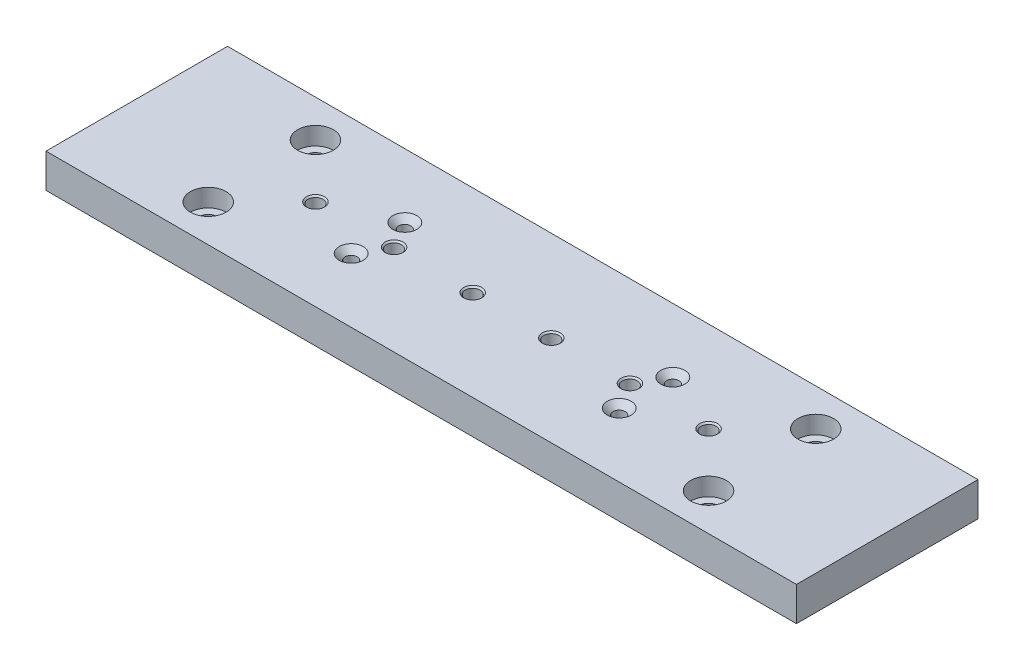
ISO-10303-21;
HEADER;
FILE_DESCRIPTION(('STEP AP214'),'2;1');
FILE_NAME('part.step','',(''),(''),'','','');
FILE_SCHEMA(('AUTOMOTIVE_DESIGN { 1 0 10303 214 1 1 1 1 }'));
ENDSEC;
DATA;
#1=APPLICATION_CONTEXT('core data for automotive mechanical design processes');
#2=APPLICATION_PROTOCOL_DEFINITION('international standard','automotive_design',2000,#1);
#3=PRODUCT_CONTEXT('',#1,'mechanical');
#4=PRODUCT('Part','Part','',(#3));
#5=PRODUCT_RELATED_PRODUCT_CATEGORY('part','',(#4));
#6=PRODUCT_DEFINITION_FORMATION('','',#4);
#7=PRODUCT_DEFINITION_CONTEXT('part definition',#1,'design');
#8=PRODUCT_DEFINITION('design','',#6,#7);
#9=PRODUCT_DEFINITION_SHAPE('','',#8);
#10=(LENGTH_UNIT() NAMED_UNIT(*) SI_UNIT(.MILLI.,.METRE.));
#11=(NAMED_UNIT(*) PLANE_ANGLE_UNIT() SI_UNIT($,.RADIAN.));
#12=(NAMED_UNIT(*) SI_UNIT($,.STERADIAN.) SOLID_ANGLE_UNIT());
#13=UNCERTAINTY_MEASURE_WITH_UNIT(LENGTH_MEASURE(1.E-05),#10,'distance_accuracy_value','');
#14=(GEOMETRIC_REPRESENTATION_CONTEXT(3) GLOBAL_UNCERTAINTY_ASSIGNED_CONTEXT((#13)) GLOBAL_UNIT_ASSIGNED_CONTEXT((#10,
#11,#12)) REPRESENTATION_CONTEXT('',''));
#15=CARTESIAN_POINT('',(0.,0.,0.));
#16=DIRECTION('',(0.,0.,1.));
#17=DIRECTION('',(1.,0.,0.));
#18=AXIS2_PLACEMENT_3D('',#15,#16,#17);
#19=CARTESIAN_POINT('',(0.,0.,0.));
#20=DIRECTION('',(0.,-1.,0.));
#21=DIRECTION('',(0.,0.,-1.));
#22=AXIS2_PLACEMENT_3D('',#19,#20,#21);
#23=PLANE('',#22);
#24=CARTESIAN_POINT('',(-55.,0.,0.));
#25=DIRECTION('',(0.,1.,0.));
#26=DIRECTION('',(0.,0.,1.));
#27=AXIS2_PLACEMENT_3D('',#24,#25,#26);
#28=CIRCLE('',#27,2.1);
#29=CARTESIAN_POINT('',(-55.,0.,2.1));
#30=VERTEX_POINT('',#29);
#31=EDGE_CURVE('E261',#30,#30,#28,.T.);
#32=ORIENTED_EDGE('',*,*,#31,.T.);
#33=EDGE_LOOP('',(#32));
#34=FACE_BOUND('',#33,.T.);
#35=CARTESIAN_POINT('',(-33.,0.,0.));
#36=DIRECTION('',(0.,1.,0.));
#37=DIRECTION('',(0.,0.,1.));
#38=AXIS2_PLACEMENT_3D('',#35,#36,#37);
#39=CIRCLE('',#38,2.1);
#40=CARTESIAN_POINT('',(-33.,0.,2.1));
#41=VERTEX_POINT('',#40);
#42=EDGE_CURVE('E251',#41,#41,#39,.T.);
#43=ORIENTED_EDGE('',*,*,#42,.T.);
#44=EDGE_LOOP('',(#43));
#45=FACE_BOUND('',#44,.T.);
#46=CARTESIAN_POINT('',(-11.,0.,0.));
#47=DIRECTION('',(0.,1.,0.));
#48=DIRECTION('',(0.,0.,1.));
#49=AXIS2_PLACEMENT_3D('',#46,#47,#48);
#50=CIRCLE('',#49,2.1);
#51=CARTESIAN_POINT('',(-11.,0.,2.1));
#52=VERTEX_POINT('',#51);
#53=EDGE_CURVE('E241',#52,#52,#50,.T.);
#54=ORIENTED_EDGE('',*,*,#53,.T.);
#55=EDGE_LOOP('',(#54));
#56=FACE_BOUND('',#55,.T.);
#57=CARTESIAN_POINT('',(11.,0.,0.));
#58=DIRECTION('',(0.,1.,0.));
#59=DIRECTION('',(0.,0.,1.));
#60=AXIS2_PLACEMENT_3D('',#57,#58,#59);
#61=CIRCLE('',#60,2.1);
#62=CARTESIAN_POINT('',(11.,0.,2.1));
#63=VERTEX_POINT('',#62);
#64=EDGE_CURVE('E231',#63,#63,#61,.T.);
#65=ORIENTED_EDGE('',*,*,#64,.T.);
#66=EDGE_LOOP('',(#65));
#67=FACE_BOUND('',#66,.T.);
#68=CARTESIAN_POINT('',(33.,0.,0.));
#69=DIRECTION('',(0.,1.,0.));
#70=DIRECTION('',(0.,0.,1.));
#71=AXIS2_PLACEMENT_3D('',#68,#69,#70);
#72=CIRCLE('',#71,2.1);
#73=CARTESIAN_POINT('',(33.,0.,2.1));
#74=VERTEX_POINT('',#73);
#75=EDGE_CURVE('E221',#74,#74,#72,.T.);
#76=ORIENTED_EDGE('',*,*,#75,.T.);
#77=EDGE_LOOP('',(#76));
#78=FACE_BOUND('',#77,.T.);
#79=CARTESIAN_POINT('',(55.,0.,0.));
#80=DIRECTION('',(0.,1.,0.));
#81=DIRECTION('',(0.,0.,1.));
#82=AXIS2_PLACEMENT_3D('',#79,#80,#81);
#83=CIRCLE('',#82,2.1);
#84=CARTESIAN_POINT('',(55.,0.,2.1));
#85=VERTEX_POINT('',#84);
#86=EDGE_CURVE('E211',#85,#85,#83,.T.);
#87=ORIENTED_EDGE('',*,*,#86,.T.);
#88=EDGE_LOOP('',(#87));
#89=FACE_BOUND('',#88,.T.);
#90=CARTESIAN_POINT('',(70.,0.,15.));
#91=DIRECTION('',(0.,1.,0.));
#92=DIRECTION('',(0.,0.,1.));
#93=AXIS2_PLACEMENT_3D('',#90,#91,#92);
#94=CIRCLE('',#93,2.75);
#95=CARTESIAN_POINT('',(70.,0.,17.75));
#96=VERTEX_POINT('',#95);
#97=EDGE_CURVE('E185',#96,#96,#94,.T.);
#98=ORIENTED_EDGE('',*,*,#97,.T.);
#99=EDGE_LOOP('',(#98));
#100=FACE_BOUND('',#99,.T.);
#101=CARTESIAN_POINT('',(-70.,0.,-15.));
#102=DIRECTION('',(0.,1.,0.));
#103=DIRECTION('',(0.,0.,1.));
#104=AXIS2_PLACEMENT_3D('',#101,#102,#103);
#105=CIRCLE('',#104,2.75);
#106=CARTESIAN_POINT('',(-70.,0.,-12.25));
#107=VERTEX_POINT('',#106);
#108=EDGE_CURVE('E172',#107,#107,#105,.T.);
#109=ORIENTED_EDGE('',*,*,#108,.T.);
#110=EDGE_LOOP('',(#109));
#111=FACE_BOUND('',#110,.T.);
#112=CARTESIAN_POINT('',(-70.,0.,15.));
#113=DIRECTION('',(0.,1.,0.));
#114=DIRECTION('',(0.,0.,1.));
#115=AXIS2_PLACEMENT_3D('',#112,#113,#114);
#116=CIRCLE('',#115,2.75);
#117=CARTESIAN_POINT('',(-70.,0.,17.75));
#118=VERTEX_POINT('',#117);
#119=EDGE_CURVE('E159',#118,#118,#116,.T.);
#120=ORIENTED_EDGE('',*,*,#119,.T.);
#121=EDGE_LOOP('',(#120));
#122=FACE_BOUND('',#121,.T.);
#123=CARTESIAN_POINT('',(-37.5,0.,-7.5));
#124=DIRECTION('',(0.,1.,0.));
#125=DIRECTION('',(0.,0.,1.));
#126=AXIS2_PLACEMENT_3D('',#123,#124,#125);
#127=CIRCLE('',#126,1.69999999999999);
#128=CARTESIAN_POINT('',(-37.5,0.,-5.80000000000001));
#129=VERTEX_POINT('',#128);
#130=EDGE_CURVE('E149',#129,#129,#127,.T.);
#131=ORIENTED_EDGE('',*,*,#130,.T.);
#132=EDGE_LOOP('',(#131));
#133=FACE_BOUND('',#132,.T.);
#134=CARTESIAN_POINT('',(-37.5,0.,7.5));
#135=DIRECTION('',(0.,1.,0.));
#136=DIRECTION('',(0.,0.,1.));
#137=AXIS2_PLACEMENT_3D('',#134,#135,#136);
#138=CIRCLE('',#137,1.69999999999999);
#139=CARTESIAN_POINT('',(-37.5,0.,9.19999999999999));
#140=VERTEX_POINT('',#139);
#141=EDGE_CURVE('E139',#140,#140,#138,.T.);
#142=ORIENTED_EDGE('',*,*,#141,.T.);
#143=EDGE_LOOP('',(#142));
#144=FACE_BOUND('',#143,.T.);
#145=CARTESIAN_POINT('',(37.5,0.,7.5));
#146=DIRECTION('',(0.,1.,0.));
#147=DIRECTION('',(0.,0.,1.));
#148=AXIS2_PLACEMENT_3D('',#145,#146,#147);
#149=CIRCLE('',#148,1.69999999999999);
#150=CARTESIAN_POINT('',(37.5,0.,9.19999999999999));
#151=VERTEX_POINT('',#150);
#152=EDGE_CURVE('E129',#151,#151,#149,.T.);
#153=ORIENTED_EDGE('',*,*,#152,.T.);
#154=EDGE_LOOP('',(#153));
#155=FACE_BOUND('',#154,.T.);
#156=CARTESIAN_POINT('',(37.5,0.,-7.5));
#157=DIRECTION('',(0.,1.,0.));
#158=DIRECTION('',(0.,0.,1.));
#159=AXIS2_PLACEMENT_3D('',#156,#157,#158);
#160=CIRCLE('',#159,1.69999999999999);
#161=CARTESIAN_POINT('',(37.5,0.,-5.80000000000001));
#162=VERTEX_POINT('',#161);
#163=EDGE_CURVE('E109',#162,#162,#160,.T.);
#164=ORIENTED_EDGE('',*,*,#163,.T.);
#165=EDGE_LOOP('',(#164));
#166=FACE_BOUND('',#165,.T.);
#167=DIRECTION('',(0.,0.,-1.));
#168=VECTOR('',#167,1.);
#169=CARTESIAN_POINT('',(105.,0.,25.4));
#170=LINE('',#169,#168);
#171=CARTESIAN_POINT('',(105.,0.,25.4));
#172=VERTEX_POINT('',#171);
#173=CARTESIAN_POINT('',(105.,0.,-25.4));
#174=VERTEX_POINT('',#173);
#175=EDGE_CURVE('E106',#172,#174,#170,.T.);
#176=ORIENTED_EDGE('',*,*,#175,.F.);
#177=DIRECTION('',(1.,0.,0.));
#178=VECTOR('',#177,1.);
#179=CARTESIAN_POINT('',(-105.,0.,25.4));
#180=LINE('',#179,#178);
#181=CARTESIAN_POINT('',(-105.,0.,25.4));
#182=VERTEX_POINT('',#181);
#183=EDGE_CURVE('E81',#182,#172,#180,.T.);
#184=ORIENTED_EDGE('',*,*,#183,.F.);
#185=DIRECTION('',(0.,0.,1.));
#186=VECTOR('',#185,1.);
#187=CARTESIAN_POINT('',(-105.,0.,25.4));
#188=LINE('',#187,#186);
#189=CARTESIAN_POINT('',(-105.,0.,-25.4));
#190=VERTEX_POINT('',#189);
#191=EDGE_CURVE('E75',#190,#182,#188,.T.);
#192=ORIENTED_EDGE('',*,*,#191,.F.);
#193=DIRECTION('',(-1.,0.,0.));
#194=VECTOR('',#193,1.);
#195=CARTESIAN_POINT('',(-105.,0.,-25.4));
#196=LINE('',#195,#194);
#197=EDGE_CURVE('E98',#174,#190,#196,.T.);
#198=ORIENTED_EDGE('',*,*,#197,.F.);
#199=EDGE_LOOP('',(#176,#184,#192,#198));
#200=FACE_BOUND('',#199,.T.);
#201=CARTESIAN_POINT('',(70.,0.,-15.));
#202=DIRECTION('',(0.,1.,0.));
#203=DIRECTION('',(0.,0.,1.));
#204=AXIS2_PLACEMENT_3D('',#201,#202,#203);
#205=CIRCLE('',#204,2.75);
#206=CARTESIAN_POINT('',(70.,0.,-12.25));
#207=VERTEX_POINT('',#206);
#208=EDGE_CURVE('E198',#207,#207,#205,.T.);
#209=ORIENTED_EDGE('',*,*,#208,.T.);
#210=EDGE_LOOP('',(#209));
#211=FACE_BOUND('',#210,.T.);
#212=ADVANCED_FACE('F41',(#34,#45,#56,#67,#78,#89,#100,#111,#122,#133,#144,#155,#166,#200,#211),
#23,.T.);
#213=CARTESIAN_POINT('',(0.,9.525,0.));
#214=DIRECTION('',(0.,-1.,0.));
#215=DIRECTION('',(0.,0.,-1.));
#216=AXIS2_PLACEMENT_3D('',#213,#214,#215);
#217=PLANE('',#216);
#218=CARTESIAN_POINT('',(-55.,9.525,0.));
#219=DIRECTION('',(0.,1.,0.));
#220=DIRECTION('',(0.,0.,1.));
#221=AXIS2_PLACEMENT_3D('',#218,#219,#220);
#222=CIRCLE('',#221,2.525);
#223=CARTESIAN_POINT('',(-55.,9.525,2.525));
#224=VERTEX_POINT('',#223);
#225=EDGE_CURVE('E267',#224,#224,#222,.T.);
#226=ORIENTED_EDGE('',*,*,#225,.F.);
#227=EDGE_LOOP('',(#226));
#228=FACE_BOUND('',#227,.T.);
#229=CARTESIAN_POINT('',(-33.,9.525,0.));
#230=DIRECTION('',(0.,1.,0.));
#231=DIRECTION('',(0.,0.,1.));
#232=AXIS2_PLACEMENT_3D('',#229,#230,#231);
#233=CIRCLE('',#232,2.525);
#234=CARTESIAN_POINT('',(-33.,9.525,2.525));
#235=VERTEX_POINT('',#234);
#236=EDGE_CURVE('E257',#235,#235,#233,.T.);
#237=ORIENTED_EDGE('',*,*,#236,.F.);
#238=EDGE_LOOP('',(#237));
#239=FACE_BOUND('',#238,.T.);
#240=CARTESIAN_POINT('',(-11.,9.525,0.));
#241=DIRECTION('',(0.,1.,0.));
#242=DIRECTION('',(0.,0.,1.));
#243=AXIS2_PLACEMENT_3D('',#240,#241,#242);
#244=CIRCLE('',#243,2.525);
#245=CARTESIAN_POINT('',(-11.,9.525,2.525));
#246=VERTEX_POINT('',#245);
#247=EDGE_CURVE('E247',#246,#246,#244,.T.);
#248=ORIENTED_EDGE('',*,*,#247,.F.);
#249=EDGE_LOOP('',(#248));
#250=FACE_BOUND('',#249,.T.);
#251=CARTESIAN_POINT('',(11.,9.525,0.));
#252=DIRECTION('',(0.,1.,0.));
#253=DIRECTION('',(0.,0.,1.));
#254=AXIS2_PLACEMENT_3D('',#251,#252,#253);
#255=CIRCLE('',#254,2.525);
#256=CARTESIAN_POINT('',(11.,9.525,2.525));
#257=VERTEX_POINT('',#256);
#258=EDGE_CURVE('E237',#257,#257,#255,.T.);
#259=ORIENTED_EDGE('',*,*,#258,.F.);
#260=EDGE_LOOP('',(#259));
#261=FACE_BOUND('',#260,.T.);
#262=CARTESIAN_POINT('',(33.,9.525,0.));
#263=DIRECTION('',(0.,1.,0.));
#264=DIRECTION('',(0.,0.,1.));
#265=AXIS2_PLACEMENT_3D('',#262,#263,#264);
#266=CIRCLE('',#265,2.525);
#267=CARTESIAN_POINT('',(33.,9.525,2.525));
#268=VERTEX_POINT('',#267);
#269=EDGE_CURVE('E227',#268,#268,#266,.T.);
#270=ORIENTED_EDGE('',*,*,#269,.F.);
#271=EDGE_LOOP('',(#270));
#272=FACE_BOUND('',#271,.T.);
#273=CARTESIAN_POINT('',(55.,9.525,0.));
#274=DIRECTION('',(0.,1.,0.));
#275=DIRECTION('',(0.,0.,1.));
#276=AXIS2_PLACEMENT_3D('',#273,#274,#275);
#277=CIRCLE('',#276,2.525);
#278=CARTESIAN_POINT('',(55.,9.525,2.525));
#279=VERTEX_POINT('',#278);
#280=EDGE_CURVE('E217',#279,#279,#277,.T.);
#281=ORIENTED_EDGE('',*,*,#280,.F.);
#282=EDGE_LOOP('',(#281));
#283=FACE_BOUND('',#282,.T.);
#284=CARTESIAN_POINT('',(70.,9.525,15.));
#285=DIRECTION('',(0.,1.,0.));
#286=DIRECTION('',(0.,0.,1.));
#287=AXIS2_PLACEMENT_3D('',#284,#285,#286);
#288=CIRCLE('',#287,5.);
#289=CARTESIAN_POINT('',(70.,9.525,20.));
#290=VERTEX_POINT('',#289);
#291=EDGE_CURVE('E194',#290,#290,#288,.T.);
#292=ORIENTED_EDGE('',*,*,#291,.F.);
#293=EDGE_LOOP('',(#292));
#294=FACE_BOUND('',#293,.T.);
#295=CARTESIAN_POINT('',(-70.,9.525,-15.));
#296=DIRECTION('',(0.,1.,0.));
#297=DIRECTION('',(0.,0.,1.));
#298=AXIS2_PLACEMENT_3D('',#295,#296,#297);
#299=CIRCLE('',#298,5.);
#300=CARTESIAN_POINT('',(-70.,9.525,-9.99999999999999));
#301=VERTEX_POINT('',#300);
#302=EDGE_CURVE('E181',#301,#301,#299,.T.);
#303=ORIENTED_EDGE('',*,*,#302,.F.);
#304=EDGE_LOOP('',(#303));
#305=FACE_BOUND('',#304,.T.);
#306=CARTESIAN_POINT('',(-70.,9.525,15.));
#307=DIRECTION('',(0.,1.,0.));
#308=DIRECTION('',(0.,0.,1.));
#309=AXIS2_PLACEMENT_3D('',#306,#307,#308);
#310=CIRCLE('',#309,5.);
#311=CARTESIAN_POINT('',(-70.,9.525,20.));
#312=VERTEX_POINT('',#311);
#313=EDGE_CURVE('E168',#312,#312,#310,.T.);
#314=ORIENTED_EDGE('',*,*,#313,.F.);
#315=EDGE_LOOP('',(#314));
#316=FACE_BOUND('',#315,.T.);
#317=CARTESIAN_POINT('',(-37.5,9.525,-7.5));
#318=DIRECTION('',(0.,1.,0.));
#319=DIRECTION('',(0.,0.,1.));
#320=AXIS2_PLACEMENT_3D('',#317,#318,#319);
#321=CIRCLE('',#320,3.36);
#322=CARTESIAN_POINT('',(-37.5,9.525,-4.14));
#323=VERTEX_POINT('',#322);
#324=EDGE_CURVE('E155',#323,#323,#321,.T.);
#325=ORIENTED_EDGE('',*,*,#324,.F.);
#326=EDGE_LOOP('',(#325));
#327=FACE_BOUND('',#326,.T.);
#328=CARTESIAN_POINT('',(-37.5,9.525,7.5));
#329=DIRECTION('',(0.,1.,0.));
#330=DIRECTION('',(0.,0.,1.));
#331=AXIS2_PLACEMENT_3D('',#328,#329,#330);
#332=CIRCLE('',#331,3.36);
#333=CARTESIAN_POINT('',(-37.5,9.525,10.86));
#334=VERTEX_POINT('',#333);
#335=EDGE_CURVE('E145',#334,#334,#332,.T.);
#336=ORIENTED_EDGE('',*,*,#335,.F.);
#337=EDGE_LOOP('',(#336));
#338=FACE_BOUND('',#337,.T.);
#339=CARTESIAN_POINT('',(37.5,9.525,7.5));
#340=DIRECTION('',(0.,1.,0.));
#341=DIRECTION('',(0.,0.,1.));
#342=AXIS2_PLACEMENT_3D('',#339,#340,#341);
#343=CIRCLE('',#342,3.36);
#344=CARTESIAN_POINT('',(37.5,9.525,10.86));
#345=VERTEX_POINT('',#344);
#346=EDGE_CURVE('E135',#345,#345,#343,.T.);
#347=ORIENTED_EDGE('',*,*,#346,.F.);
#348=EDGE_LOOP('',(#347));
#349=FACE_BOUND('',#348,.T.);
#350=CARTESIAN_POINT('',(37.5,9.525,-7.5));
#351=DIRECTION('',(0.,1.,0.));
#352=DIRECTION('',(0.,0.,1.));
#353=AXIS2_PLACEMENT_3D('',#350,#351,#352);
#354=CIRCLE('',#353,3.36);
#355=CARTESIAN_POINT('',(37.5,9.525,-4.14));
#356=VERTEX_POINT('',#355);
#357=EDGE_CURVE('E125',#356,#356,#354,.T.);
#358=ORIENTED_EDGE('',*,*,#357,.F.);
#359=EDGE_LOOP('',(#358));
#360=FACE_BOUND('',#359,.T.);
#361=DIRECTION('',(0.,0.,-1.));
#362=VECTOR('',#361,1.);
#363=CARTESIAN_POINT('',(105.,9.525,25.4));
#364=LINE('',#363,#362);
#365=CARTESIAN_POINT('',(105.,9.525,25.4));
#366=VERTEX_POINT('',#365);
#367=CARTESIAN_POINT('',(105.,9.525,-25.4));
#368=VERTEX_POINT('',#367);
#369=EDGE_CURVE('E94',#366,#368,#364,.T.);
#370=ORIENTED_EDGE('',*,*,#369,.T.);
#371=DIRECTION('',(-1.,0.,0.));
#372=VECTOR('',#371,1.);
#373=CARTESIAN_POINT('',(-105.,9.525,-25.4));
#374=LINE('',#373,#372);
#375=CARTESIAN_POINT('',(-105.,9.525,-25.4));
#376=VERTEX_POINT('',#375);
#377=EDGE_CURVE('E88',#368,#376,#374,.T.);
#378=ORIENTED_EDGE('',*,*,#377,.T.);
#379=DIRECTION('',(0.,0.,1.));
#380=VECTOR('',#379,1.);
#381=CARTESIAN_POINT('',(-105.,9.525,25.4));
#382=LINE('',#381,#380);
#383=CARTESIAN_POINT('',(-105.,9.525,25.4));
#384=VERTEX_POINT('',#383);
#385=EDGE_CURVE('E92',#376,#384,#382,.T.);
#386=ORIENTED_EDGE('',*,*,#385,.T.);
#387=DIRECTION('',(1.,0.,0.));
#388=VECTOR('',#387,1.);
#389=CARTESIAN_POINT('',(-105.,9.525,25.4));
#390=LINE('',#389,#388);
#391=EDGE_CURVE('E58',#384,#366,#390,.T.);
#392=ORIENTED_EDGE('',*,*,#391,.T.);
#393=EDGE_LOOP('',(#370,#378,#386,#392));
#394=FACE_BOUND('',#393,.T.);
#395=CARTESIAN_POINT('',(70.,9.525,-15.));
#396=DIRECTION('',(0.,1.,0.));
#397=DIRECTION('',(0.,0.,1.));
#398=AXIS2_PLACEMENT_3D('',#395,#396,#397);
#399=CIRCLE('',#398,5.);
#400=CARTESIAN_POINT('',(70.,9.525,-9.99999999999999));
#401=VERTEX_POINT('',#400);
#402=EDGE_CURVE('E207',#401,#401,#399,.T.);
#403=ORIENTED_EDGE('',*,*,#402,.F.);
#404=EDGE_LOOP('',(#403));
#405=FACE_BOUND('',#404,.T.);
#406=ADVANCED_FACE('F89',(#228,#239,#250,#261,#272,#283,#294,#305,#316,#327,#338,#349,#360,#394,
#405),#217,.F.);
#407=CARTESIAN_POINT('',(105.,9.525,25.4));
#408=DIRECTION('',(-1.,0.,0.));
#409=DIRECTION('',(0.,0.,1.));
#410=AXIS2_PLACEMENT_3D('',#407,#408,#409);
#411=PLANE('',#410);
#412=ORIENTED_EDGE('',*,*,#175,.T.);
#413=DIRECTION('',(0.,-1.,0.));
#414=VECTOR('',#413,1.);
#415=CARTESIAN_POINT('',(105.,9.525,-25.4));
#416=LINE('',#415,#414);
#417=EDGE_CURVE('E11',#368,#174,#416,.T.);
#418=ORIENTED_EDGE('',*,*,#417,.F.);
#419=ORIENTED_EDGE('',*,*,#369,.F.);
#420=DIRECTION('',(0.,-1.,0.));
#421=VECTOR('',#420,1.);
#422=CARTESIAN_POINT('',(105.,9.525,25.4));
#423=LINE('',#422,#421);
#424=EDGE_CURVE('E102',#366,#172,#423,.T.);
#425=ORIENTED_EDGE('',*,*,#424,.T.);
#426=EDGE_LOOP('',(#412,#418,#419,#425));
#427=FACE_BOUND('',#426,.T.);
#428=ADVANCED_FACE('F43',(#427),#411,.F.);
#429=CARTESIAN_POINT('',(-105.,9.525,-25.4));
#430=DIRECTION('',(0.,0.,1.));
#431=DIRECTION('',(1.,0.,0.));
#432=AXIS2_PLACEMENT_3D('',#429,#430,#431);
#433=PLANE('',#432);
#434=ORIENTED_EDGE('',*,*,#197,.T.);
#435=DIRECTION('',(0.,-1.,0.));
#436=VECTOR('',#435,1.);
#437=CARTESIAN_POINT('',(-105.,9.525,-25.4));
#438=LINE('',#437,#436);
#439=EDGE_CURVE('E50',#376,#190,#438,.T.);
#440=ORIENTED_EDGE('',*,*,#439,.F.);
#441=ORIENTED_EDGE('',*,*,#377,.F.);
#442=ORIENTED_EDGE('',*,*,#417,.T.);
#443=EDGE_LOOP('',(#434,#440,#441,#442));
#444=FACE_BOUND('',#443,.T.);
#445=ADVANCED_FACE('F97',(#444),#433,.F.);
#446=CARTESIAN_POINT('',(-105.,9.525,25.4));
#447=DIRECTION('',(1.,0.,0.));
#448=DIRECTION('',(0.,0.,-1.));
#449=AXIS2_PLACEMENT_3D('',#446,#447,#448);
#450=PLANE('',#449);
#451=ORIENTED_EDGE('',*,*,#191,.T.);
#452=DIRECTION('',(0.,-1.,0.));
#453=VECTOR('',#452,1.);
#454=CARTESIAN_POINT('',(-105.,9.525,25.4));
#455=LINE('',#454,#453);
#456=EDGE_CURVE('E99',#384,#182,#455,.T.);
#457=ORIENTED_EDGE('',*,*,#456,.F.);
#458=ORIENTED_EDGE('',*,*,#385,.F.);
#459=ORIENTED_EDGE('',*,*,#439,.T.);
#460=EDGE_LOOP('',(#451,#457,#458,#459));
#461=FACE_BOUND('',#460,.T.);
#462=ADVANCED_FACE('F100',(#461),#450,.F.);
#463=CARTESIAN_POINT('',(-105.,9.525,25.4));
#464=DIRECTION('',(0.,0.,-1.));
#465=DIRECTION('',(-1.,0.,0.));
#466=AXIS2_PLACEMENT_3D('',#463,#464,#465);
#467=PLANE('',#466);
#468=ORIENTED_EDGE('',*,*,#183,.T.);
#469=ORIENTED_EDGE('',*,*,#424,.F.);
#470=ORIENTED_EDGE('',*,*,#391,.F.);
#471=ORIENTED_EDGE('',*,*,#456,.T.);
#472=EDGE_LOOP('',(#468,#469,#470,#471));
#473=FACE_BOUND('',#472,.T.);
#474=ADVANCED_FACE('F114',(#473),#467,.F.);
#475=CARTESIAN_POINT('',(37.5,9.525,-7.5));
#476=DIRECTION('',(0.,1.,0.));
#477=DIRECTION('',(0.,0.,1.));
#478=AXIS2_PLACEMENT_3D('',#475,#476,#477);
#479=CYLINDRICAL_SURFACE('',#478,1.69999999999999);
#480=ORIENTED_EDGE('',*,*,#163,.F.);
#481=EDGE_LOOP('',(#480));
#482=FACE_BOUND('',#481,.T.);
#483=CARTESIAN_POINT('',(37.5,7.865,-7.5));
#484=DIRECTION('',(0.,1.,0.));
#485=DIRECTION('',(0.,0.,1.));
#486=AXIS2_PLACEMENT_3D('',#483,#484,#485);
#487=CIRCLE('',#486,1.7);
#488=CARTESIAN_POINT('',(37.5,7.865,-5.8));
#489=VERTEX_POINT('',#488);
#490=EDGE_CURVE('E122',#489,#489,#487,.T.);
#491=ORIENTED_EDGE('',*,*,#490,.T.);
#492=EDGE_LOOP('',(#491));
#493=FACE_BOUND('',#492,.T.);
#494=ADVANCED_FACE('F304',(#482,#493),#479,.F.);
#495=CARTESIAN_POINT('',(37.5,9.525,-7.5));
#496=DIRECTION('',(0.,1.,0.));
#497=DIRECTION('',(0.,0.,1.));
#498=AXIS2_PLACEMENT_3D('',#495,#496,#497);
#499=CONICAL_SURFACE('',#498,3.36,0.785398163397449);
#500=ORIENTED_EDGE('',*,*,#490,.F.);
#501=EDGE_LOOP('',(#500));
#502=FACE_BOUND('',#501,.T.);
#503=ORIENTED_EDGE('',*,*,#357,.T.);
#504=EDGE_LOOP('',(#503));
#505=FACE_BOUND('',#504,.T.);
#506=ADVANCED_FACE('F301',(#502,#505),#499,.F.);
#507=CARTESIAN_POINT('',(37.5,9.525,7.5));
#508=DIRECTION('',(0.,1.,0.));
#509=DIRECTION('',(0.,0.,1.));
#510=AXIS2_PLACEMENT_3D('',#507,#508,#509);
#511=CYLINDRICAL_SURFACE('',#510,1.69999999999999);
#512=ORIENTED_EDGE('',*,*,#152,.F.);
#513=EDGE_LOOP('',(#512));
#514=FACE_BOUND('',#513,.T.);
#515=CARTESIAN_POINT('',(37.5,7.865,7.5));
#516=DIRECTION('',(0.,1.,0.));
#517=DIRECTION('',(0.,0.,1.));
#518=AXIS2_PLACEMENT_3D('',#515,#516,#517);
#519=CIRCLE('',#518,1.7);
#520=CARTESIAN_POINT('',(37.5,7.865,9.2));
#521=VERTEX_POINT('',#520);
#522=EDGE_CURVE('E132',#521,#521,#519,.T.);
#523=ORIENTED_EDGE('',*,*,#522,.T.);
#524=EDGE_LOOP('',(#523));
#525=FACE_BOUND('',#524,.T.);
#526=ADVANCED_FACE('F303',(#514,#525),#511,.F.);
#527=CARTESIAN_POINT('',(37.5,9.525,7.5));
#528=DIRECTION('',(0.,1.,0.));
#529=DIRECTION('',(0.,0.,1.));
#530=AXIS2_PLACEMENT_3D('',#527,#528,#529);
#531=CONICAL_SURFACE('',#530,3.36,0.785398163397449);
#532=ORIENTED_EDGE('',*,*,#522,.F.);
#533=EDGE_LOOP('',(#532));
#534=FACE_BOUND('',#533,.T.);
#535=ORIENTED_EDGE('',*,*,#346,.T.);
#536=EDGE_LOOP('',(#535));
#537=FACE_BOUND('',#536,.T.);
#538=ADVANCED_FACE('F311',(#534,#537),#531,.F.);
#539=CARTESIAN_POINT('',(-37.5,9.525,7.5));
#540=DIRECTION('',(0.,1.,0.));
#541=DIRECTION('',(0.,0.,1.));
#542=AXIS2_PLACEMENT_3D('',#539,#540,#541);
#543=CYLINDRICAL_SURFACE('',#542,1.69999999999999);
#544=ORIENTED_EDGE('',*,*,#141,.F.);
#545=EDGE_LOOP('',(#544));
#546=FACE_BOUND('',#545,.T.);
#547=CARTESIAN_POINT('',(-37.5,7.865,7.5));
#548=DIRECTION('',(0.,1.,0.));
#549=DIRECTION('',(0.,0.,1.));
#550=AXIS2_PLACEMENT_3D('',#547,#548,#549);
#551=CIRCLE('',#550,1.7);
#552=CARTESIAN_POINT('',(-37.5,7.865,9.2));
#553=VERTEX_POINT('',#552);
#554=EDGE_CURVE('E142',#553,#553,#551,.T.);
#555=ORIENTED_EDGE('',*,*,#554,.T.);
#556=EDGE_LOOP('',(#555));
#557=FACE_BOUND('',#556,.T.);
#558=ADVANCED_FACE('F485',(#546,#557),#543,.F.);
#559=CARTESIAN_POINT('',(-37.5,9.525,7.5));
#560=DIRECTION('',(0.,1.,0.));
#561=DIRECTION('',(0.,0.,1.));
#562=AXIS2_PLACEMENT_3D('',#559,#560,#561);
#563=CONICAL_SURFACE('',#562,3.36,0.785398163397449);
#564=ORIENTED_EDGE('',*,*,#554,.F.);
#565=EDGE_LOOP('',(#564));
#566=FACE_BOUND('',#565,.T.);
#567=ORIENTED_EDGE('',*,*,#335,.T.);
#568=EDGE_LOOP('',(#567));
#569=FACE_BOUND('',#568,.T.);
#570=ADVANCED_FACE('F489',(#566,#569),#563,.F.);
#571=CARTESIAN_POINT('',(-37.5,9.525,-7.5));
#572=DIRECTION('',(0.,1.,0.));
#573=DIRECTION('',(0.,0.,1.));
#574=AXIS2_PLACEMENT_3D('',#571,#572,#573);
#575=CYLINDRICAL_SURFACE('',#574,1.69999999999999);
#576=ORIENTED_EDGE('',*,*,#130,.F.);
#577=EDGE_LOOP('',(#576));
#578=FACE_BOUND('',#577,.T.);
#579=CARTESIAN_POINT('',(-37.5,7.865,-7.5));
#580=DIRECTION('',(0.,1.,0.));
#581=DIRECTION('',(0.,0.,1.));
#582=AXIS2_PLACEMENT_3D('',#579,#580,#581);
#583=CIRCLE('',#582,1.7);
#584=CARTESIAN_POINT('',(-37.5,7.865,-5.8));
#585=VERTEX_POINT('',#584);
#586=EDGE_CURVE('E152',#585,#585,#583,.T.);
#587=ORIENTED_EDGE('',*,*,#586,.T.);
#588=EDGE_LOOP('',(#587));
#589=FACE_BOUND('',#588,.T.);
#590=ADVANCED_FACE('F499',(#578,#589),#575,.F.);
#591=CARTESIAN_POINT('',(-37.5,9.525,-7.5));
#592=DIRECTION('',(0.,1.,0.));
#593=DIRECTION('',(0.,0.,1.));
#594=AXIS2_PLACEMENT_3D('',#591,#592,#593);
#595=CONICAL_SURFACE('',#594,3.36,0.785398163397449);
#596=ORIENTED_EDGE('',*,*,#586,.F.);
#597=EDGE_LOOP('',(#596));
#598=FACE_BOUND('',#597,.T.);
#599=ORIENTED_EDGE('',*,*,#324,.T.);
#600=EDGE_LOOP('',(#599));
#601=FACE_BOUND('',#600,.T.);
#602=ADVANCED_FACE('F502',(#598,#601),#595,.F.);
#603=CARTESIAN_POINT('',(-70.,9.525,15.));
#604=DIRECTION('',(0.,1.,0.));
#605=DIRECTION('',(0.,0.,1.));
#606=AXIS2_PLACEMENT_3D('',#603,#604,#605);
#607=CYLINDRICAL_SURFACE('',#606,2.75);
#608=ORIENTED_EDGE('',*,*,#119,.F.);
#609=EDGE_LOOP('',(#608));
#610=FACE_BOUND('',#609,.T.);
#611=CARTESIAN_POINT('',(-70.,4.525,15.));
#612=DIRECTION('',(0.,1.,0.));
#613=DIRECTION('',(0.,0.,1.));
#614=AXIS2_PLACEMENT_3D('',#611,#612,#613);
#615=CIRCLE('',#614,2.75);
#616=CARTESIAN_POINT('',(-70.,4.525,17.75));
#617=VERTEX_POINT('',#616);
#618=EDGE_CURVE('E162',#617,#617,#615,.T.);
#619=ORIENTED_EDGE('',*,*,#618,.T.);
#620=EDGE_LOOP('',(#619));
#621=FACE_BOUND('',#620,.T.);
#622=ADVANCED_FACE('F627',(#610,#621),#607,.F.);
#623=CARTESIAN_POINT('',(-67.25,4.525,15.));
#624=DIRECTION('',(0.,-1.,0.));
#625=DIRECTION('',(0.,0.,-1.));
#626=AXIS2_PLACEMENT_3D('',#623,#624,#625);
#627=PLANE('',#626);
#628=ORIENTED_EDGE('',*,*,#618,.F.);
#629=EDGE_LOOP('',(#628));
#630=FACE_BOUND('',#629,.T.);
#631=CARTESIAN_POINT('',(-70.,4.525,15.));
#632=DIRECTION('',(0.,1.,0.));
#633=DIRECTION('',(0.,0.,1.));
#634=AXIS2_PLACEMENT_3D('',#631,#632,#633);
#635=CIRCLE('',#634,5.);
#636=CARTESIAN_POINT('',(-70.,4.525,20.));
#637=VERTEX_POINT('',#636);
#638=EDGE_CURVE('E165',#637,#637,#635,.T.);
#639=ORIENTED_EDGE('',*,*,#638,.T.);
#640=EDGE_LOOP('',(#639));
#641=FACE_BOUND('',#640,.T.);
#642=ADVANCED_FACE('F618',(#630,#641),#627,.F.);
#643=CARTESIAN_POINT('',(-70.,9.525,15.));
#644=DIRECTION('',(0.,1.,0.));
#645=DIRECTION('',(0.,0.,1.));
#646=AXIS2_PLACEMENT_3D('',#643,#644,#645);
#647=CYLINDRICAL_SURFACE('',#646,5.);
#648=ORIENTED_EDGE('',*,*,#638,.F.);
#649=EDGE_LOOP('',(#648));
#650=FACE_BOUND('',#649,.T.);
#651=ORIENTED_EDGE('',*,*,#313,.T.);
#652=EDGE_LOOP('',(#651));
#653=FACE_BOUND('',#652,.T.);
#654=ADVANCED_FACE('F481',(#650,#653),#647,.F.);
#655=CARTESIAN_POINT('',(-70.,9.525,-15.));
#656=DIRECTION('',(0.,1.,0.));
#657=DIRECTION('',(0.,0.,1.));
#658=AXIS2_PLACEMENT_3D('',#655,#656,#657);
#659=CYLINDRICAL_SURFACE('',#658,2.75);
#660=ORIENTED_EDGE('',*,*,#108,.F.);
#661=EDGE_LOOP('',(#660));
#662=FACE_BOUND('',#661,.T.);
#663=CARTESIAN_POINT('',(-70.,4.525,-15.));
#664=DIRECTION('',(0.,1.,0.));
#665=DIRECTION('',(0.,0.,1.));
#666=AXIS2_PLACEMENT_3D('',#663,#664,#665);
#667=CIRCLE('',#666,2.75);
#668=CARTESIAN_POINT('',(-70.,4.525,-12.25));
#669=VERTEX_POINT('',#668);
#670=EDGE_CURVE('E175',#669,#669,#667,.T.);
#671=ORIENTED_EDGE('',*,*,#670,.T.);
#672=EDGE_LOOP('',(#671));
#673=FACE_BOUND('',#672,.T.);
#674=ADVANCED_FACE('F601',(#662,#673),#659,.F.);
#675=CARTESIAN_POINT('',(-67.25,4.525,-15.));
#676=DIRECTION('',(0.,-1.,0.));
#677=DIRECTION('',(0.,0.,-1.));
#678=AXIS2_PLACEMENT_3D('',#675,#676,#677);
#679=PLANE('',#678);
#680=ORIENTED_EDGE('',*,*,#670,.F.);
#681=EDGE_LOOP('',(#680));
#682=FACE_BOUND('',#681,.T.);
#683=CARTESIAN_POINT('',(-70.,4.525,-15.));
#684=DIRECTION('',(0.,1.,0.));
#685=DIRECTION('',(0.,0.,1.));
#686=AXIS2_PLACEMENT_3D('',#683,#684,#685);
#687=CIRCLE('',#686,5.);
#688=CARTESIAN_POINT('',(-70.,4.525,-9.99999999999999));
#689=VERTEX_POINT('',#688);
#690=EDGE_CURVE('E178',#689,#689,#687,.T.);
#691=ORIENTED_EDGE('',*,*,#690,.T.);
#692=EDGE_LOOP('',(#691));
#693=FACE_BOUND('',#692,.T.);
#694=ADVANCED_FACE('F592',(#682,#693),#679,.F.);
#695=CARTESIAN_POINT('',(-70.,9.525,-15.));
#696=DIRECTION('',(0.,1.,0.));
#697=DIRECTION('',(0.,0.,1.));
#698=AXIS2_PLACEMENT_3D('',#695,#696,#697);
#699=CYLINDRICAL_SURFACE('',#698,5.);
#700=ORIENTED_EDGE('',*,*,#690,.F.);
#701=EDGE_LOOP('',(#700));
#702=FACE_BOUND('',#701,.T.);
#703=ORIENTED_EDGE('',*,*,#302,.T.);
#704=EDGE_LOOP('',(#703));
#705=FACE_BOUND('',#704,.T.);
#706=ADVANCED_FACE('F581',(#702,#705),#699,.F.);
#707=CARTESIAN_POINT('',(70.,9.525,15.));
#708=DIRECTION('',(0.,1.,0.));
#709=DIRECTION('',(0.,0.,1.));
#710=AXIS2_PLACEMENT_3D('',#707,#708,#709);
#711=CYLINDRICAL_SURFACE('',#710,2.75);
#712=ORIENTED_EDGE('',*,*,#97,.F.);
#713=EDGE_LOOP('',(#712));
#714=FACE_BOUND('',#713,.T.);
#715=CARTESIAN_POINT('',(70.,4.525,15.));
#716=DIRECTION('',(0.,1.,0.));
#717=DIRECTION('',(0.,0.,1.));
#718=AXIS2_PLACEMENT_3D('',#715,#716,#717);
#719=CIRCLE('',#718,2.75);
#720=CARTESIAN_POINT('',(70.,4.525,17.75));
#721=VERTEX_POINT('',#720);
#722=EDGE_CURVE('E188',#721,#721,#719,.T.);
#723=ORIENTED_EDGE('',*,*,#722,.T.);
#724=EDGE_LOOP('',(#723));
#725=FACE_BOUND('',#724,.T.);
#726=ADVANCED_FACE('F574',(#714,#725),#711,.F.);
#727=CARTESIAN_POINT('',(72.75,4.525,15.));
#728=DIRECTION('',(0.,-1.,0.));
#729=DIRECTION('',(0.,0.,-1.));
#730=AXIS2_PLACEMENT_3D('',#727,#728,#729);
#731=PLANE('',#730);
#732=ORIENTED_EDGE('',*,*,#722,.F.);
#733=EDGE_LOOP('',(#732));
#734=FACE_BOUND('',#733,.T.);
#735=CARTESIAN_POINT('',(70.,4.525,15.));
#736=DIRECTION('',(0.,1.,0.));
#737=DIRECTION('',(0.,0.,1.));
#738=AXIS2_PLACEMENT_3D('',#735,#736,#737);
#739=CIRCLE('',#738,5.);
#740=CARTESIAN_POINT('',(70.,4.525,20.));
#741=VERTEX_POINT('',#740);
#742=EDGE_CURVE('E191',#741,#741,#739,.T.);
#743=ORIENTED_EDGE('',*,*,#742,.T.);
#744=EDGE_LOOP('',(#743));
#745=FACE_BOUND('',#744,.T.);
#746=ADVANCED_FACE('F540',(#734,#745),#731,.F.);
#747=CARTESIAN_POINT('',(70.,9.525,15.));
#748=DIRECTION('',(0.,1.,0.));
#749=DIRECTION('',(0.,0.,1.));
#750=AXIS2_PLACEMENT_3D('',#747,#748,#749);
#751=CYLINDRICAL_SURFACE('',#750,5.);
#752=ORIENTED_EDGE('',*,*,#742,.F.);
#753=EDGE_LOOP('',(#752));
#754=FACE_BOUND('',#753,.T.);
#755=ORIENTED_EDGE('',*,*,#291,.T.);
#756=EDGE_LOOP('',(#755));
#757=FACE_BOUND('',#756,.T.);
#758=ADVANCED_FACE('F536',(#754,#757),#751,.F.);
#759=CARTESIAN_POINT('',(70.,9.525,-15.));
#760=DIRECTION('',(0.,1.,0.));
#761=DIRECTION('',(0.,0.,1.));
#762=AXIS2_PLACEMENT_3D('',#759,#760,#761);
#763=CYLINDRICAL_SURFACE('',#762,2.75);
#764=ORIENTED_EDGE('',*,*,#208,.F.);
#765=EDGE_LOOP('',(#764));
#766=FACE_BOUND('',#765,.T.);
#767=CARTESIAN_POINT('',(70.,4.525,-15.));
#768=DIRECTION('',(0.,1.,0.));
#769=DIRECTION('',(0.,0.,1.));
#770=AXIS2_PLACEMENT_3D('',#767,#768,#769);
#771=CIRCLE('',#770,2.75);
#772=CARTESIAN_POINT('',(70.,4.525,-12.25));
#773=VERTEX_POINT('',#772);
#774=EDGE_CURVE('E201',#773,#773,#771,.T.);
#775=ORIENTED_EDGE('',*,*,#774,.T.);
#776=EDGE_LOOP('',(#775));
#777=FACE_BOUND('',#776,.T.);
#778=ADVANCED_FACE('F539',(#766,#777),#763,.F.);
#779=CARTESIAN_POINT('',(72.75,4.525,-15.));
#780=DIRECTION('',(0.,-1.,0.));
#781=DIRECTION('',(0.,0.,-1.));
#782=AXIS2_PLACEMENT_3D('',#779,#780,#781);
#783=PLANE('',#782);
#784=ORIENTED_EDGE('',*,*,#774,.F.);
#785=EDGE_LOOP('',(#784));
#786=FACE_BOUND('',#785,.T.);
#787=CARTESIAN_POINT('',(70.,4.525,-15.));
#788=DIRECTION('',(0.,1.,0.));
#789=DIRECTION('',(0.,0.,1.));
#790=AXIS2_PLACEMENT_3D('',#787,#788,#789);
#791=CIRCLE('',#790,5.);
#792=CARTESIAN_POINT('',(70.,4.525,-9.99999999999999));
#793=VERTEX_POINT('',#792);
#794=EDGE_CURVE('E204',#793,#793,#791,.T.);
#795=ORIENTED_EDGE('',*,*,#794,.T.);
#796=EDGE_LOOP('',(#795));
#797=FACE_BOUND('',#796,.T.);
#798=ADVANCED_FACE('F529',(#786,#797),#783,.F.);
#799=CARTESIAN_POINT('',(70.,9.525,-15.));
#800=DIRECTION('',(0.,1.,0.));
#801=DIRECTION('',(0.,0.,1.));
#802=AXIS2_PLACEMENT_3D('',#799,#800,#801);
#803=CYLINDRICAL_SURFACE('',#802,5.);
#804=ORIENTED_EDGE('',*,*,#794,.F.);
#805=EDGE_LOOP('',(#804));
#806=FACE_BOUND('',#805,.T.);
#807=ORIENTED_EDGE('',*,*,#402,.T.);
#808=EDGE_LOOP('',(#807));
#809=FACE_BOUND('',#808,.T.);
#810=ADVANCED_FACE('F353',(#806,#809),#803,.F.);
#811=CARTESIAN_POINT('',(55.,9.525,0.));
#812=DIRECTION('',(0.,1.,0.));
#813=DIRECTION('',(0.,0.,1.));
#814=AXIS2_PLACEMENT_3D('',#811,#812,#813);
#815=CYLINDRICAL_SURFACE('',#814,2.1);
#816=ORIENTED_EDGE('',*,*,#86,.F.);
#817=EDGE_LOOP('',(#816));
#818=FACE_BOUND('',#817,.T.);
#819=CARTESIAN_POINT('',(55.,9.1,0.));
#820=DIRECTION('',(0.,1.,0.));
#821=DIRECTION('',(0.,0.,1.));
#822=AXIS2_PLACEMENT_3D('',#819,#820,#821);
#823=CIRCLE('',#822,2.1);
#824=CARTESIAN_POINT('',(55.,9.1,2.1));
#825=VERTEX_POINT('',#824);
#826=EDGE_CURVE('E214',#825,#825,#823,.T.);
#827=ORIENTED_EDGE('',*,*,#826,.T.);
#828=EDGE_LOOP('',(#827));
#829=FACE_BOUND('',#828,.T.);
#830=ADVANCED_FACE('F346',(#818,#829),#815,.F.);
#831=CARTESIAN_POINT('',(55.,9.525,0.));
#832=DIRECTION('',(0.,1.,0.));
#833=DIRECTION('',(0.,0.,1.));
#834=AXIS2_PLACEMENT_3D('',#831,#832,#833);
#835=CONICAL_SURFACE('',#834,2.525,0.78539816339745);
#836=ORIENTED_EDGE('',*,*,#826,.F.);
#837=EDGE_LOOP('',(#836));
#838=FACE_BOUND('',#837,.T.);
#839=ORIENTED_EDGE('',*,*,#280,.T.);
#840=EDGE_LOOP('',(#839));
#841=FACE_BOUND('',#840,.T.);
#842=ADVANCED_FACE('F352',(#838,#841),#835,.F.);
#843=CARTESIAN_POINT('',(33.,9.525,0.));
#844=DIRECTION('',(0.,1.,0.));
#845=DIRECTION('',(0.,0.,1.));
#846=AXIS2_PLACEMENT_3D('',#843,#844,#845);
#847=CYLINDRICAL_SURFACE('',#846,2.1);
#848=ORIENTED_EDGE('',*,*,#75,.F.);
#849=EDGE_LOOP('',(#848));
#850=FACE_BOUND('',#849,.T.);
#851=CARTESIAN_POINT('',(33.,9.1,0.));
#852=DIRECTION('',(0.,1.,0.));
#853=DIRECTION('',(0.,0.,1.));
#854=AXIS2_PLACEMENT_3D('',#851,#852,#853);
#855=CIRCLE('',#854,2.1);
#856=CARTESIAN_POINT('',(33.,9.1,2.1));
#857=VERTEX_POINT('',#856);
#858=EDGE_CURVE('E224',#857,#857,#855,.T.);
#859=ORIENTED_EDGE('',*,*,#858,.T.);
#860=EDGE_LOOP('',(#859));
#861=FACE_BOUND('',#860,.T.);
#862=ADVANCED_FACE('F366',(#850,#861),#847,.F.);
#863=CARTESIAN_POINT('',(33.,9.525,0.));
#864=DIRECTION('',(0.,1.,0.));
#865=DIRECTION('',(0.,0.,1.));
#866=AXIS2_PLACEMENT_3D('',#863,#864,#865);
#867=CONICAL_SURFACE('',#866,2.525,0.78539816339745);
#868=ORIENTED_EDGE('',*,*,#858,.F.);
#869=EDGE_LOOP('',(#868));
#870=FACE_BOUND('',#869,.T.);
#871=ORIENTED_EDGE('',*,*,#269,.T.);
#872=EDGE_LOOP('',(#871));
#873=FACE_BOUND('',#872,.T.);
#874=ADVANCED_FACE('F376',(#870,#873),#867,.F.);
#875=CARTESIAN_POINT('',(11.,9.525,0.));
#876=DIRECTION('',(0.,1.,0.));
#877=DIRECTION('',(0.,0.,1.));
#878=AXIS2_PLACEMENT_3D('',#875,#876,#877);
#879=CYLINDRICAL_SURFACE('',#878,2.1);
#880=ORIENTED_EDGE('',*,*,#64,.F.);
#881=EDGE_LOOP('',(#880));
#882=FACE_BOUND('',#881,.T.);
#883=CARTESIAN_POINT('',(11.,9.1,0.));
#884=DIRECTION('',(0.,1.,0.));
#885=DIRECTION('',(0.,0.,1.));
#886=AXIS2_PLACEMENT_3D('',#883,#884,#885);
#887=CIRCLE('',#886,2.1);
#888=CARTESIAN_POINT('',(11.,9.1,2.1));
#889=VERTEX_POINT('',#888);
#890=EDGE_CURVE('E234',#889,#889,#887,.T.);
#891=ORIENTED_EDGE('',*,*,#890,.T.);
#892=EDGE_LOOP('',(#891));
#893=FACE_BOUND('',#892,.T.);
#894=ADVANCED_FACE('F388',(#882,#893),#879,.F.);
#895=CARTESIAN_POINT('',(11.,9.525,0.));
#896=DIRECTION('',(0.,1.,0.));
#897=DIRECTION('',(0.,0.,1.));
#898=AXIS2_PLACEMENT_3D('',#895,#896,#897);
#899=CONICAL_SURFACE('',#898,2.525,0.785398163397448);
#900=ORIENTED_EDGE('',*,*,#890,.F.);
#901=EDGE_LOOP('',(#900));
#902=FACE_BOUND('',#901,.T.);
#903=ORIENTED_EDGE('',*,*,#258,.T.);
#904=EDGE_LOOP('',(#903));
#905=FACE_BOUND('',#904,.T.);
#906=ADVANCED_FACE('F398',(#902,#905),#899,.F.);
#907=CARTESIAN_POINT('',(-11.,9.525,0.));
#908=DIRECTION('',(0.,1.,0.));
#909=DIRECTION('',(0.,0.,1.));
#910=AXIS2_PLACEMENT_3D('',#907,#908,#909);
#911=CYLINDRICAL_SURFACE('',#910,2.1);
#912=ORIENTED_EDGE('',*,*,#53,.F.);
#913=EDGE_LOOP('',(#912));
#914=FACE_BOUND('',#913,.T.);
#915=CARTESIAN_POINT('',(-11.,9.1,0.));
#916=DIRECTION('',(0.,1.,0.));
#917=DIRECTION('',(0.,0.,1.));
#918=AXIS2_PLACEMENT_3D('',#915,#916,#917);
#919=CIRCLE('',#918,2.1);
#920=CARTESIAN_POINT('',(-11.,9.1,2.1));
#921=VERTEX_POINT('',#920);
#922=EDGE_CURVE('E244',#921,#921,#919,.T.);
#923=ORIENTED_EDGE('',*,*,#922,.T.);
#924=EDGE_LOOP('',(#923));
#925=FACE_BOUND('',#924,.T.);
#926=ADVANCED_FACE('F410',(#914,#925),#911,.F.);
#927=CARTESIAN_POINT('',(-11.,9.525,0.));
#928=DIRECTION('',(0.,1.,0.));
#929=DIRECTION('',(0.,0.,1.));
#930=AXIS2_PLACEMENT_3D('',#927,#928,#929);
#931=CONICAL_SURFACE('',#930,2.525,0.785398163397448);
#932=ORIENTED_EDGE('',*,*,#922,.F.);
#933=EDGE_LOOP('',(#932));
#934=FACE_BOUND('',#933,.T.);
#935=ORIENTED_EDGE('',*,*,#247,.T.);
#936=EDGE_LOOP('',(#935));
#937=FACE_BOUND('',#936,.T.);
#938=ADVANCED_FACE('F420',(#934,#937),#931,.F.);
#939=CARTESIAN_POINT('',(-33.,9.525,0.));
#940=DIRECTION('',(0.,1.,0.));
#941=DIRECTION('',(0.,0.,1.));
#942=AXIS2_PLACEMENT_3D('',#939,#940,#941);
#943=CYLINDRICAL_SURFACE('',#942,2.1);
#944=ORIENTED_EDGE('',*,*,#42,.F.);
#945=EDGE_LOOP('',(#944));
#946=FACE_BOUND('',#945,.T.);
#947=CARTESIAN_POINT('',(-33.,9.1,0.));
#948=DIRECTION('',(0.,1.,0.));
#949=DIRECTION('',(0.,0.,1.));
#950=AXIS2_PLACEMENT_3D('',#947,#948,#949);
#951=CIRCLE('',#950,2.1);
#952=CARTESIAN_POINT('',(-33.,9.1,2.1));
#953=VERTEX_POINT('',#952);
#954=EDGE_CURVE('E254',#953,#953,#951,.T.);
#955=ORIENTED_EDGE('',*,*,#954,.T.);
#956=EDGE_LOOP('',(#955));
#957=FACE_BOUND('',#956,.T.);
#958=ADVANCED_FACE('F432',(#946,#957),#943,.F.);
#959=CARTESIAN_POINT('',(-33.,9.525,0.));
#960=DIRECTION('',(0.,1.,0.));
#961=DIRECTION('',(0.,0.,1.));
#962=AXIS2_PLACEMENT_3D('',#959,#960,#961);
#963=CONICAL_SURFACE('',#962,2.525,0.78539816339745);
#964=ORIENTED_EDGE('',*,*,#954,.F.);
#965=EDGE_LOOP('',(#964));
#966=FACE_BOUND('',#965,.T.);
#967=ORIENTED_EDGE('',*,*,#236,.T.);
#968=EDGE_LOOP('',(#967));
#969=FACE_BOUND('',#968,.T.);
#970=ADVANCED_FACE('F442',(#966,#969),#963,.F.);
#971=CARTESIAN_POINT('',(-55.,9.525,0.));
#972=DIRECTION('',(0.,1.,0.));
#973=DIRECTION('',(0.,0.,1.));
#974=AXIS2_PLACEMENT_3D('',#971,#972,#973);
#975=CYLINDRICAL_SURFACE('',#974,2.1);
#976=ORIENTED_EDGE('',*,*,#31,.F.);
#977=EDGE_LOOP('',(#976));
#978=FACE_BOUND('',#977,.T.);
#979=CARTESIAN_POINT('',(-55.,9.1,0.));
#980=DIRECTION('',(0.,1.,0.));
#981=DIRECTION('',(0.,0.,1.));
#982=AXIS2_PLACEMENT_3D('',#979,#980,#981);
#983=CIRCLE('',#982,2.1);
#984=CARTESIAN_POINT('',(-55.,9.1,2.1));
#985=VERTEX_POINT('',#984);
#986=EDGE_CURVE('E264',#985,#985,#983,.T.);
#987=ORIENTED_EDGE('',*,*,#986,.T.);
#988=EDGE_LOOP('',(#987));
#989=FACE_BOUND('',#988,.T.);
#990=ADVANCED_FACE('F454',(#978,#989),#975,.F.);
#991=CARTESIAN_POINT('',(-55.,9.525,0.));
#992=DIRECTION('',(0.,1.,0.));
#993=DIRECTION('',(0.,0.,1.));
#994=AXIS2_PLACEMENT_3D('',#991,#992,#993);
#995=CONICAL_SURFACE('',#994,2.525,0.78539816339745);
#996=ORIENTED_EDGE('',*,*,#986,.F.);
#997=EDGE_LOOP('',(#996));
#998=FACE_BOUND('',#997,.T.);
#999=ORIENTED_EDGE('',*,*,#225,.T.);
#1000=EDGE_LOOP('',(#999));
#1001=FACE_BOUND('',#1000,.T.);
#1002=ADVANCED_FACE('F272',(#998,#1001),#995,.F.);
#1003=CLOSED_SHELL('',(#212,#406,#428,#445,#462,#474,#494,#506,#526,#538,#558,#570,#590,#602,
#622,#642,#654,#674,#694,#706,#726,#746,#758,#778,#798,#810,#830,#842,#862,#874,#894,#906,#926,
#938,#958,#970,#990,#1002));
#1004=MANIFOLD_SOLID_BREP('B2',#1003);
#1005=ADVANCED_BREP_SHAPE_REPRESENTATION('',(#18,#1004),#14);
#1006=SHAPE_DEFINITION_REPRESENTATION(#9,#1005);
ENDSEC;
END-ISO-10303-21;
